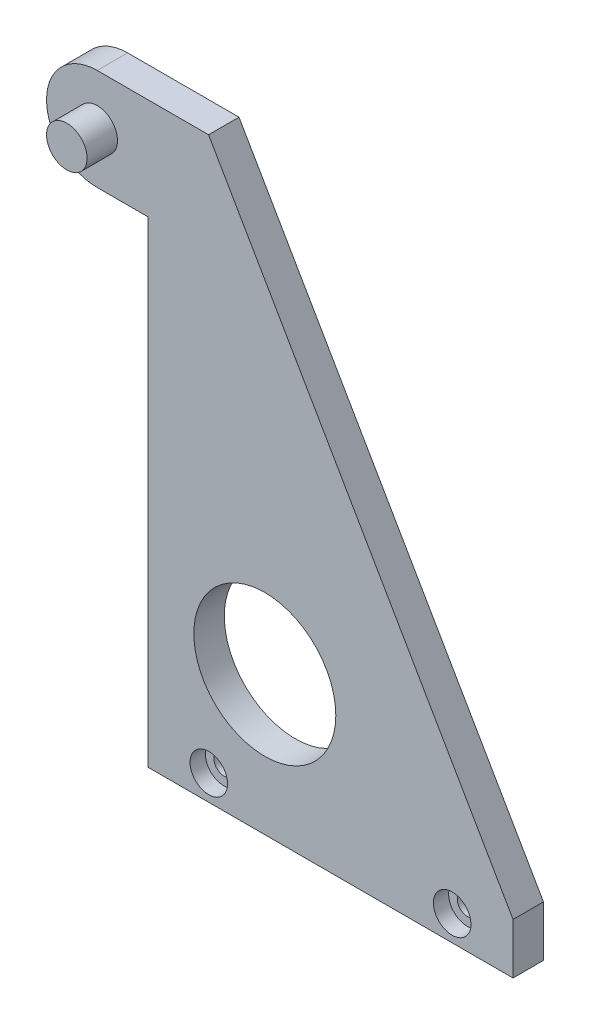
ISO-10303-21;
HEADER;
FILE_DESCRIPTION(('STEP AP214'),'2;1');
FILE_NAME('part.step','',(''),(''),'','','');
FILE_SCHEMA(('AUTOMOTIVE_DESIGN { 1 0 10303 214 1 1 1 1 }'));
ENDSEC;
DATA;
#1=APPLICATION_CONTEXT('core data for automotive mechanical design processes');
#2=APPLICATION_PROTOCOL_DEFINITION('international standard','automotive_design',2000,#1);
#3=PRODUCT_CONTEXT('',#1,'mechanical');
#4=PRODUCT('Part','Part','',(#3));
#5=PRODUCT_RELATED_PRODUCT_CATEGORY('part','',(#4));
#6=PRODUCT_DEFINITION_FORMATION('','',#4);
#7=PRODUCT_DEFINITION_CONTEXT('part definition',#1,'design');
#8=PRODUCT_DEFINITION('design','',#6,#7);
#9=PRODUCT_DEFINITION_SHAPE('','',#8);
#10=(LENGTH_UNIT() NAMED_UNIT(*) SI_UNIT(.MILLI.,.METRE.));
#11=(NAMED_UNIT(*) PLANE_ANGLE_UNIT() SI_UNIT($,.RADIAN.));
#12=(NAMED_UNIT(*) SI_UNIT($,.STERADIAN.) SOLID_ANGLE_UNIT());
#13=UNCERTAINTY_MEASURE_WITH_UNIT(LENGTH_MEASURE(1.E-05),#10,'distance_accuracy_value','');
#14=(GEOMETRIC_REPRESENTATION_CONTEXT(3) GLOBAL_UNCERTAINTY_ASSIGNED_CONTEXT((#13)) GLOBAL_UNIT_ASSIGNED_CONTEXT((#10,
#11,#12)) REPRESENTATION_CONTEXT('',''));
#15=CARTESIAN_POINT('',(0.,0.,0.));
#16=DIRECTION('',(0.,0.,1.));
#17=DIRECTION('',(1.,0.,0.));
#18=AXIS2_PLACEMENT_3D('',#15,#16,#17);
#19=CARTESIAN_POINT('',(-12.,2.49999999999995,0.));
#20=DIRECTION('',(0.,0.,1.));
#21=DIRECTION('',(1.,0.,0.));
#22=AXIS2_PLACEMENT_3D('',#19,#20,#21);
#23=CYLINDRICAL_SURFACE('',#22,1.);
#24=CARTESIAN_POINT('',(-12.,2.49999999999995,0.));
#25=DIRECTION('',(0.,0.,1.));
#26=DIRECTION('',(-1.,0.,0.));
#27=AXIS2_PLACEMENT_3D('',#24,#25,#26);
#28=CIRCLE('',#27,1.);
#29=CARTESIAN_POINT('',(-13.,2.49999999999995,0.));
#30=VERTEX_POINT('',#29);
#31=EDGE_CURVE('E140',#30,#30,#28,.T.);
#32=ORIENTED_EDGE('',*,*,#31,.F.);
#33=EDGE_LOOP('',(#32));
#34=FACE_BOUND('',#33,.T.);
#35=CARTESIAN_POINT('',(-12.,2.49999999999995,1.5));
#36=DIRECTION('',(0.,0.,1.));
#37=DIRECTION('',(1.,0.,0.));
#38=AXIS2_PLACEMENT_3D('',#35,#36,#37);
#39=CIRCLE('',#38,1.);
#40=CARTESIAN_POINT('',(-11.,2.49999999999995,1.5));
#41=VERTEX_POINT('',#40);
#42=EDGE_CURVE('E46',#41,#41,#39,.F.);
#43=ORIENTED_EDGE('',*,*,#42,.F.);
#44=EDGE_LOOP('',(#43));
#45=FACE_BOUND('',#44,.T.);
#46=ADVANCED_FACE('F41',(#34,#45),#23,.F.);
#47=CARTESIAN_POINT('',(12.,2.49999999999995,0.));
#48=DIRECTION('',(0.,0.,1.));
#49=DIRECTION('',(1.,0.,0.));
#50=AXIS2_PLACEMENT_3D('',#47,#48,#49);
#51=CYLINDRICAL_SURFACE('',#50,1.);
#52=CARTESIAN_POINT('',(12.,2.49999999999995,0.));
#53=DIRECTION('',(0.,0.,1.));
#54=DIRECTION('',(1.,0.,0.));
#55=AXIS2_PLACEMENT_3D('',#52,#53,#54);
#56=CIRCLE('',#55,1.);
#57=CARTESIAN_POINT('',(13.,2.49999999999995,0.));
#58=VERTEX_POINT('',#57);
#59=EDGE_CURVE('E155',#58,#58,#56,.T.);
#60=ORIENTED_EDGE('',*,*,#59,.F.);
#61=EDGE_LOOP('',(#60));
#62=FACE_BOUND('',#61,.T.);
#63=CARTESIAN_POINT('',(12.,2.49999999999995,1.5));
#64=DIRECTION('',(0.,0.,1.));
#65=DIRECTION('',(1.,0.,0.));
#66=AXIS2_PLACEMENT_3D('',#63,#64,#65);
#67=CIRCLE('',#66,1.);
#68=CARTESIAN_POINT('',(13.,2.49999999999995,1.5));
#69=VERTEX_POINT('',#68);
#70=EDGE_CURVE('E133',#69,#69,#67,.F.);
#71=ORIENTED_EDGE('',*,*,#70,.F.);
#72=EDGE_LOOP('',(#71));
#73=FACE_BOUND('',#72,.T.);
#74=ADVANCED_FACE('F217',(#62,#73),#51,.F.);
#75=CARTESIAN_POINT('',(-23.,52.,0.));
#76=DIRECTION('',(0.,0.,-1.));
#77=DIRECTION('',(-1.,0.,0.));
#78=AXIS2_PLACEMENT_3D('',#75,#76,#77);
#79=CYLINDRICAL_SURFACE('',#78,4.99999999999999);
#80=DIRECTION('',(0.,0.,-1.));
#81=VECTOR('',#80,1.);
#82=CARTESIAN_POINT('',(-23.,57.,3.));
#83=LINE('',#82,#81);
#84=CARTESIAN_POINT('',(-23.,57.,0.));
#85=VERTEX_POINT('',#84);
#86=CARTESIAN_POINT('',(-23.,57.,3.));
#87=VERTEX_POINT('',#86);
#88=EDGE_CURVE('E123',#85,#87,#83,.F.);
#89=ORIENTED_EDGE('',*,*,#88,.F.);
#90=CARTESIAN_POINT('',(-23.,52.,0.));
#91=DIRECTION('',(0.,0.,-1.));
#92=DIRECTION('',(-1.,0.,0.));
#93=AXIS2_PLACEMENT_3D('',#90,#91,#92);
#94=CIRCLE('',#93,4.99999999999999);
#95=CARTESIAN_POINT('',(-23.,47.,0.));
#96=VERTEX_POINT('',#95);
#97=EDGE_CURVE('E51',#96,#85,#94,.T.);
#98=ORIENTED_EDGE('',*,*,#97,.F.);
#99=DIRECTION('',(0.,0.,-1.));
#100=VECTOR('',#99,1.);
#101=CARTESIAN_POINT('',(-23.,47.,3.));
#102=LINE('',#101,#100);
#103=CARTESIAN_POINT('',(-23.,47.,3.));
#104=VERTEX_POINT('',#103);
#105=EDGE_CURVE('E131',#104,#96,#102,.T.);
#106=ORIENTED_EDGE('',*,*,#105,.F.);
#107=CARTESIAN_POINT('',(-23.,52.,3.));
#108=DIRECTION('',(0.,0.,-1.));
#109=DIRECTION('',(-1.,0.,0.));
#110=AXIS2_PLACEMENT_3D('',#107,#108,#109);
#111=CIRCLE('',#110,4.99999999999999);
#112=EDGE_CURVE('E11',#87,#104,#111,.F.);
#113=ORIENTED_EDGE('',*,*,#112,.F.);
#114=EDGE_LOOP('',(#89,#98,#106,#113));
#115=FACE_BOUND('',#114,.T.);
#116=ADVANCED_FACE('F44',(#115),#79,.T.);
#117=CARTESIAN_POINT('',(-28.,47.,3.));
#118=DIRECTION('',(0.,1.,0.));
#119=DIRECTION('',(-1.,0.,0.));
#120=AXIS2_PLACEMENT_3D('',#117,#118,#119);
#121=PLANE('',#120);
#122=DIRECTION('',(1.,0.,0.));
#123=VECTOR('',#122,1.);
#124=CARTESIAN_POINT('',(-28.,47.,3.));
#125=LINE('',#124,#123);
#126=CARTESIAN_POINT('',(-18.,47.,3.));
#127=VERTEX_POINT('',#126);
#128=EDGE_CURVE('E98',#104,#127,#125,.T.);
#129=ORIENTED_EDGE('',*,*,#128,.F.);
#130=ORIENTED_EDGE('',*,*,#105,.T.);
#131=DIRECTION('',(1.,0.,0.));
#132=VECTOR('',#131,1.);
#133=CARTESIAN_POINT('',(-28.,47.,0.));
#134=LINE('',#133,#132);
#135=CARTESIAN_POINT('',(-18.,47.,0.));
#136=VERTEX_POINT('',#135);
#137=EDGE_CURVE('E118',#96,#136,#134,.T.);
#138=ORIENTED_EDGE('',*,*,#137,.T.);
#139=DIRECTION('',(0.,0.,-1.));
#140=VECTOR('',#139,1.);
#141=CARTESIAN_POINT('',(-18.,47.,3.));
#142=LINE('',#141,#140);
#143=EDGE_CURVE('E110',#127,#136,#142,.T.);
#144=ORIENTED_EDGE('',*,*,#143,.F.);
#145=EDGE_LOOP('',(#129,#130,#138,#144));
#146=FACE_BOUND('',#145,.T.);
#147=ADVANCED_FACE('F116',(#146),#121,.F.);
#148=CARTESIAN_POINT('',(-18.,47.,3.));
#149=DIRECTION('',(1.,0.,0.));
#150=DIRECTION('',(0.,1.,0.));
#151=AXIS2_PLACEMENT_3D('',#148,#149,#150);
#152=PLANE('',#151);
#153=DIRECTION('',(0.,-1.,0.));
#154=VECTOR('',#153,1.);
#155=CARTESIAN_POINT('',(-18.,47.,0.));
#156=LINE('',#155,#154);
#157=CARTESIAN_POINT('',(-18.,0.,0.));
#158=VERTEX_POINT('',#157);
#159=EDGE_CURVE('E173',#136,#158,#156,.T.);
#160=ORIENTED_EDGE('',*,*,#159,.T.);
#161=DIRECTION('',(0.,0.,-1.));
#162=VECTOR('',#161,1.);
#163=CARTESIAN_POINT('',(-18.,0.,3.));
#164=LINE('',#163,#162);
#165=CARTESIAN_POINT('',(-18.,0.,3.));
#166=VERTEX_POINT('',#165);
#167=EDGE_CURVE('E112',#166,#158,#164,.T.);
#168=ORIENTED_EDGE('',*,*,#167,.F.);
#169=DIRECTION('',(0.,-1.,0.));
#170=VECTOR('',#169,1.);
#171=CARTESIAN_POINT('',(-18.,47.,3.));
#172=LINE('',#171,#170);
#173=EDGE_CURVE('E101',#127,#166,#172,.T.);
#174=ORIENTED_EDGE('',*,*,#173,.F.);
#175=ORIENTED_EDGE('',*,*,#143,.T.);
#176=EDGE_LOOP('',(#160,#168,#174,#175));
#177=FACE_BOUND('',#176,.T.);
#178=ADVANCED_FACE('F109',(#177),#152,.F.);
#179=CARTESIAN_POINT('',(-18.,0.,3.));
#180=DIRECTION('',(0.,1.,0.));
#181=DIRECTION('',(-1.,0.,0.));
#182=AXIS2_PLACEMENT_3D('',#179,#180,#181);
#183=PLANE('',#182);
#184=DIRECTION('',(1.,0.,0.));
#185=VECTOR('',#184,1.);
#186=CARTESIAN_POINT('',(-18.,0.,0.));
#187=LINE('',#186,#185);
#188=CARTESIAN_POINT('',(18.,0.,0.));
#189=VERTEX_POINT('',#188);
#190=EDGE_CURVE('E175',#158,#189,#187,.T.);
#191=ORIENTED_EDGE('',*,*,#190,.T.);
#192=DIRECTION('',(0.,0.,-1.));
#193=VECTOR('',#192,1.);
#194=CARTESIAN_POINT('',(18.,0.,3.));
#195=LINE('',#194,#193);
#196=CARTESIAN_POINT('',(18.,0.,3.));
#197=VERTEX_POINT('',#196);
#198=EDGE_CURVE('E125',#197,#189,#195,.T.);
#199=ORIENTED_EDGE('',*,*,#198,.F.);
#200=DIRECTION('',(1.,0.,0.));
#201=VECTOR('',#200,1.);
#202=CARTESIAN_POINT('',(-18.,0.,3.));
#203=LINE('',#202,#201);
#204=EDGE_CURVE('E114',#166,#197,#203,.T.);
#205=ORIENTED_EDGE('',*,*,#204,.F.);
#206=ORIENTED_EDGE('',*,*,#167,.T.);
#207=EDGE_LOOP('',(#191,#199,#205,#206));
#208=FACE_BOUND('',#207,.T.);
#209=ADVANCED_FACE('F207',(#208),#183,.F.);
#210=CARTESIAN_POINT('',(18.,0.,3.));
#211=DIRECTION('',(-1.,0.,0.));
#212=DIRECTION('',(0.,0.,1.));
#213=AXIS2_PLACEMENT_3D('',#210,#211,#212);
#214=PLANE('',#213);
#215=DIRECTION('',(0.,1.,0.));
#216=VECTOR('',#215,1.);
#217=CARTESIAN_POINT('',(18.,0.,0.));
#218=LINE('',#217,#216);
#219=CARTESIAN_POINT('',(18.,5.00000000000001,0.));
#220=VERTEX_POINT('',#219);
#221=EDGE_CURVE('E177',#189,#220,#218,.T.);
#222=ORIENTED_EDGE('',*,*,#221,.T.);
#223=DIRECTION('',(0.,0.,-1.));
#224=VECTOR('',#223,1.);
#225=CARTESIAN_POINT('',(18.,5.00000000000001,3.));
#226=LINE('',#225,#224);
#227=CARTESIAN_POINT('',(18.,5.00000000000001,3.));
#228=VERTEX_POINT('',#227);
#229=EDGE_CURVE('E185',#228,#220,#226,.T.);
#230=ORIENTED_EDGE('',*,*,#229,.F.);
#231=DIRECTION('',(0.,1.,0.));
#232=VECTOR('',#231,1.);
#233=CARTESIAN_POINT('',(18.,0.,3.));
#234=LINE('',#233,#232);
#235=EDGE_CURVE('E165',#197,#228,#234,.T.);
#236=ORIENTED_EDGE('',*,*,#235,.F.);
#237=ORIENTED_EDGE('',*,*,#198,.T.);
#238=EDGE_LOOP('',(#222,#230,#236,#237));
#239=FACE_BOUND('',#238,.T.);
#240=ADVANCED_FACE('F192',(#239),#214,.F.);
#241=CARTESIAN_POINT('',(18.,5.00000000000001,3.));
#242=DIRECTION('',(-0.86602540378444,-0.499999999999998,0.));
#243=DIRECTION('',(0.499999999999998,-0.86602540378444,0.));
#244=AXIS2_PLACEMENT_3D('',#241,#242,#243);
#245=PLANE('',#244);
#246=DIRECTION('',(-0.499999999999998,0.86602540378444,0.));
#247=VECTOR('',#246,1.);
#248=CARTESIAN_POINT('',(18.,5.00000000000001,0.));
#249=LINE('',#248,#247);
#250=CARTESIAN_POINT('',(-12.0222139978604,57.,0.));
#251=VERTEX_POINT('',#250);
#252=EDGE_CURVE('E179',#220,#251,#249,.T.);
#253=ORIENTED_EDGE('',*,*,#252,.T.);
#254=DIRECTION('',(0.,0.,-1.));
#255=VECTOR('',#254,1.);
#256=CARTESIAN_POINT('',(-12.0222139978604,57.,3.));
#257=LINE('',#256,#255);
#258=CARTESIAN_POINT('',(-12.0222139978604,57.,3.));
#259=VERTEX_POINT('',#258);
#260=EDGE_CURVE('E171',#259,#251,#257,.T.);
#261=ORIENTED_EDGE('',*,*,#260,.F.);
#262=DIRECTION('',(-0.499999999999998,0.86602540378444,0.));
#263=VECTOR('',#262,1.);
#264=CARTESIAN_POINT('',(18.,5.00000000000001,3.));
#265=LINE('',#264,#263);
#266=EDGE_CURVE('E167',#228,#259,#265,.T.);
#267=ORIENTED_EDGE('',*,*,#266,.F.);
#268=ORIENTED_EDGE('',*,*,#229,.T.);
#269=EDGE_LOOP('',(#253,#261,#267,#268));
#270=FACE_BOUND('',#269,.T.);
#271=ADVANCED_FACE('F202',(#270),#245,.F.);
#272=CARTESIAN_POINT('',(-12.0222139978604,57.,3.));
#273=DIRECTION('',(0.,-1.,0.));
#274=DIRECTION('',(1.,0.,0.));
#275=AXIS2_PLACEMENT_3D('',#272,#273,#274);
#276=PLANE('',#275);
#277=DIRECTION('',(-1.,0.,0.));
#278=VECTOR('',#277,1.);
#279=CARTESIAN_POINT('',(-12.0222139978604,57.,0.));
#280=LINE('',#279,#278);
#281=EDGE_CURVE('E105',#251,#85,#280,.T.);
#282=ORIENTED_EDGE('',*,*,#281,.T.);
#283=ORIENTED_EDGE('',*,*,#88,.T.);
#284=DIRECTION('',(-1.,0.,0.));
#285=VECTOR('',#284,1.);
#286=CARTESIAN_POINT('',(-12.0222139978604,57.,3.));
#287=LINE('',#286,#285);
#288=EDGE_CURVE('E169',#259,#87,#287,.T.);
#289=ORIENTED_EDGE('',*,*,#288,.F.);
#290=ORIENTED_EDGE('',*,*,#260,.T.);
#291=EDGE_LOOP('',(#282,#283,#289,#290));
#292=FACE_BOUND('',#291,.T.);
#293=ADVANCED_FACE('F206',(#292),#276,.F.);
#294=CARTESIAN_POINT('',(0.,0.,3.));
#295=DIRECTION('',(0.,0.,-1.));
#296=DIRECTION('',(-1.,0.,0.));
#297=AXIS2_PLACEMENT_3D('',#294,#295,#296);
#298=PLANE('',#297);
#299=CARTESIAN_POINT('',(-12.,2.49999999999995,3.));
#300=DIRECTION('',(0.,0.,1.));
#301=DIRECTION('',(1.,0.,0.));
#302=AXIS2_PLACEMENT_3D('',#299,#300,#301);
#303=CIRCLE('',#302,1.85);
#304=CARTESIAN_POINT('',(-10.15,2.49999999999995,3.));
#305=VERTEX_POINT('',#304);
#306=EDGE_CURVE('E150',#305,#305,#303,.T.);
#307=ORIENTED_EDGE('',*,*,#306,.F.);
#308=EDGE_LOOP('',(#307));
#309=FACE_BOUND('',#308,.T.);
#310=CARTESIAN_POINT('',(12.,2.49999999999995,3.));
#311=DIRECTION('',(0.,0.,1.));
#312=DIRECTION('',(1.,0.,0.));
#313=AXIS2_PLACEMENT_3D('',#310,#311,#312);
#314=CIRCLE('',#313,1.85);
#315=CARTESIAN_POINT('',(13.85,2.49999999999995,3.));
#316=VERTEX_POINT('',#315);
#317=EDGE_CURVE('E143',#316,#316,#314,.T.);
#318=ORIENTED_EDGE('',*,*,#317,.F.);
#319=EDGE_LOOP('',(#318));
#320=FACE_BOUND('',#319,.T.);
#321=CARTESIAN_POINT('',(-23.,52.,3.));
#322=DIRECTION('',(0.,0.,-1.));
#323=DIRECTION('',(-1.,0.,0.));
#324=AXIS2_PLACEMENT_3D('',#321,#322,#323);
#325=CIRCLE('',#324,2.);
#326=CARTESIAN_POINT('',(-25.,52.,3.));
#327=VERTEX_POINT('',#326);
#328=EDGE_CURVE('E120',#327,#327,#325,.F.);
#329=ORIENTED_EDGE('',*,*,#328,.F.);
#330=EDGE_LOOP('',(#329));
#331=FACE_BOUND('',#330,.T.);
#332=CARTESIAN_POINT('',(-6.47635753390574,13.6875392105491,3.));
#333=DIRECTION('',(0.,0.,1.));
#334=DIRECTION('',(1.,0.,0.));
#335=AXIS2_PLACEMENT_3D('',#332,#333,#334);
#336=CIRCLE('',#335,7.);
#337=CARTESIAN_POINT('',(0.523642466094258,13.6875392105491,3.));
#338=VERTEX_POINT('',#337);
#339=EDGE_CURVE('E158',#338,#338,#336,.T.);
#340=ORIENTED_EDGE('',*,*,#339,.F.);
#341=EDGE_LOOP('',(#340));
#342=FACE_BOUND('',#341,.T.);
#343=ORIENTED_EDGE('',*,*,#288,.T.);
#344=ORIENTED_EDGE('',*,*,#112,.T.);
#345=ORIENTED_EDGE('',*,*,#128,.T.);
#346=ORIENTED_EDGE('',*,*,#173,.T.);
#347=ORIENTED_EDGE('',*,*,#204,.T.);
#348=ORIENTED_EDGE('',*,*,#235,.T.);
#349=ORIENTED_EDGE('',*,*,#266,.T.);
#350=EDGE_LOOP('',(#343,#344,#345,#346,#347,#348,#349));
#351=FACE_BOUND('',#350,.T.);
#352=ADVANCED_FACE('F100',(#309,#320,#331,#342,#351),#298,.F.);
#353=CARTESIAN_POINT('',(0.,0.,0.));
#354=DIRECTION('',(0.,0.,-1.));
#355=DIRECTION('',(-1.,0.,0.));
#356=AXIS2_PLACEMENT_3D('',#353,#354,#355);
#357=PLANE('',#356);
#358=ORIENTED_EDGE('',*,*,#31,.T.);
#359=EDGE_LOOP('',(#358));
#360=FACE_BOUND('',#359,.T.);
#361=ORIENTED_EDGE('',*,*,#59,.T.);
#362=EDGE_LOOP('',(#361));
#363=FACE_BOUND('',#362,.T.);
#364=CARTESIAN_POINT('',(-6.47635753390574,13.6875392105491,0.));
#365=DIRECTION('',(0.,0.,1.));
#366=DIRECTION('',(1.,0.,0.));
#367=AXIS2_PLACEMENT_3D('',#364,#365,#366);
#368=CIRCLE('',#367,7.);
#369=CARTESIAN_POINT('',(0.523642466094258,13.6875392105491,0.));
#370=VERTEX_POINT('',#369);
#371=EDGE_CURVE('E159',#370,#370,#368,.T.);
#372=ORIENTED_EDGE('',*,*,#371,.T.);
#373=EDGE_LOOP('',(#372));
#374=FACE_BOUND('',#373,.T.);
#375=ORIENTED_EDGE('',*,*,#137,.F.);
#376=ORIENTED_EDGE('',*,*,#97,.T.);
#377=ORIENTED_EDGE('',*,*,#281,.F.);
#378=ORIENTED_EDGE('',*,*,#252,.F.);
#379=ORIENTED_EDGE('',*,*,#221,.F.);
#380=ORIENTED_EDGE('',*,*,#190,.F.);
#381=ORIENTED_EDGE('',*,*,#159,.F.);
#382=EDGE_LOOP('',(#375,#376,#377,#378,#379,#380,#381));
#383=FACE_BOUND('',#382,.T.);
#384=ADVANCED_FACE('F198',(#360,#363,#374,#383),#357,.T.);
#385=CARTESIAN_POINT('',(-6.47635753390574,13.6875392105491,0.));
#386=DIRECTION('',(0.,0.,1.));
#387=DIRECTION('',(1.,0.,0.));
#388=AXIS2_PLACEMENT_3D('',#385,#386,#387);
#389=CYLINDRICAL_SURFACE('',#388,7.);
#390=ORIENTED_EDGE('',*,*,#371,.F.);
#391=EDGE_LOOP('',(#390));
#392=FACE_BOUND('',#391,.T.);
#393=ORIENTED_EDGE('',*,*,#339,.T.);
#394=EDGE_LOOP('',(#393));
#395=FACE_BOUND('',#394,.T.);
#396=ADVANCED_FACE('F231',(#392,#395),#389,.F.);
#397=CARTESIAN_POINT('',(-23.,52.,6.));
#398=DIRECTION('',(0.,0.,-1.));
#399=DIRECTION('',(-1.,0.,0.));
#400=AXIS2_PLACEMENT_3D('',#397,#398,#399);
#401=CYLINDRICAL_SURFACE('',#400,2.);
#402=CARTESIAN_POINT('',(-23.,52.,6.));
#403=DIRECTION('',(0.,0.,1.));
#404=DIRECTION('',(1.,0.,0.));
#405=AXIS2_PLACEMENT_3D('',#402,#403,#404);
#406=CIRCLE('',#405,2.);
#407=CARTESIAN_POINT('',(-21.,52.,6.));
#408=VERTEX_POINT('',#407);
#409=EDGE_CURVE('E135',#408,#408,#406,.T.);
#410=ORIENTED_EDGE('',*,*,#409,.F.);
#411=EDGE_LOOP('',(#410));
#412=FACE_BOUND('',#411,.T.);
#413=ORIENTED_EDGE('',*,*,#328,.T.);
#414=EDGE_LOOP('',(#413));
#415=FACE_BOUND('',#414,.T.);
#416=ADVANCED_FACE('F228',(#412,#415),#401,.T.);
#417=CARTESIAN_POINT('',(-23.,52.,6.));
#418=DIRECTION('',(0.,0.,1.));
#419=DIRECTION('',(1.,0.,0.));
#420=AXIS2_PLACEMENT_3D('',#417,#418,#419);
#421=PLANE('',#420);
#422=ORIENTED_EDGE('',*,*,#409,.T.);
#423=EDGE_LOOP('',(#422));
#424=FACE_BOUND('',#423,.T.);
#425=ADVANCED_FACE('F273',(#424),#421,.T.);
#426=CARTESIAN_POINT('',(12.,2.49999999999995,1.5));
#427=DIRECTION('',(0.,0.,1.));
#428=DIRECTION('',(1.,0.,0.));
#429=AXIS2_PLACEMENT_3D('',#426,#427,#428);
#430=PLANE('',#429);
#431=CARTESIAN_POINT('',(12.,2.49999999999995,1.5));
#432=DIRECTION('',(0.,0.,1.));
#433=DIRECTION('',(1.,0.,0.));
#434=AXIS2_PLACEMENT_3D('',#431,#432,#433);
#435=CIRCLE('',#434,1.85);
#436=CARTESIAN_POINT('',(13.85,2.49999999999995,1.5));
#437=VERTEX_POINT('',#436);
#438=EDGE_CURVE('E136',#437,#437,#435,.T.);
#439=ORIENTED_EDGE('',*,*,#438,.T.);
#440=EDGE_LOOP('',(#439));
#441=FACE_BOUND('',#440,.T.);
#442=ORIENTED_EDGE('',*,*,#70,.T.);
#443=EDGE_LOOP('',(#442));
#444=FACE_BOUND('',#443,.T.);
#445=ADVANCED_FACE('F280',(#441,#444),#430,.T.);
#446=CARTESIAN_POINT('',(12.,2.49999999999995,1.5));
#447=DIRECTION('',(0.,0.,1.));
#448=DIRECTION('',(1.,0.,0.));
#449=AXIS2_PLACEMENT_3D('',#446,#447,#448);
#450=CYLINDRICAL_SURFACE('',#449,1.85);
#451=ORIENTED_EDGE('',*,*,#438,.F.);
#452=EDGE_LOOP('',(#451));
#453=FACE_BOUND('',#452,.T.);
#454=ORIENTED_EDGE('',*,*,#317,.T.);
#455=EDGE_LOOP('',(#454));
#456=FACE_BOUND('',#455,.T.);
#457=ADVANCED_FACE('F287',(#453,#456),#450,.F.);
#458=CARTESIAN_POINT('',(-12.,2.49999999999995,1.5));
#459=DIRECTION('',(0.,0.,1.));
#460=DIRECTION('',(1.,0.,0.));
#461=AXIS2_PLACEMENT_3D('',#458,#459,#460);
#462=PLANE('',#461);
#463=CARTESIAN_POINT('',(-12.,2.49999999999995,1.5));
#464=DIRECTION('',(0.,0.,1.));
#465=DIRECTION('',(1.,0.,0.));
#466=AXIS2_PLACEMENT_3D('',#463,#464,#465);
#467=CIRCLE('',#466,1.85);
#468=CARTESIAN_POINT('',(-10.15,2.49999999999995,1.5));
#469=VERTEX_POINT('',#468);
#470=EDGE_CURVE('E407',#469,#469,#467,.T.);
#471=ORIENTED_EDGE('',*,*,#470,.T.);
#472=EDGE_LOOP('',(#471));
#473=FACE_BOUND('',#472,.T.);
#474=ORIENTED_EDGE('',*,*,#42,.T.);
#475=EDGE_LOOP('',(#474));
#476=FACE_BOUND('',#475,.T.);
#477=ADVANCED_FACE('F294',(#473,#476),#462,.T.);
#478=CARTESIAN_POINT('',(-12.,2.49999999999995,1.5));
#479=DIRECTION('',(0.,0.,1.));
#480=DIRECTION('',(1.,0.,0.));
#481=AXIS2_PLACEMENT_3D('',#478,#479,#480);
#482=CYLINDRICAL_SURFACE('',#481,1.85);
#483=ORIENTED_EDGE('',*,*,#470,.F.);
#484=EDGE_LOOP('',(#483));
#485=FACE_BOUND('',#484,.T.);
#486=ORIENTED_EDGE('',*,*,#306,.T.);
#487=EDGE_LOOP('',(#486));
#488=FACE_BOUND('',#487,.T.);
#489=ADVANCED_FACE('F302',(#485,#488),#482,.F.);
#490=CLOSED_SHELL('',(#46,#74,#116,#147,#178,#209,#240,#271,#293,#352,#384,#396,#416,#425,#445,
#457,#477,#489));
#491=MANIFOLD_SOLID_BREP('B2',#490);
#492=ADVANCED_BREP_SHAPE_REPRESENTATION('',(#18,#491),#14);
#493=SHAPE_DEFINITION_REPRESENTATION(#9,#492);
ENDSEC;
END-ISO-10303-21;
